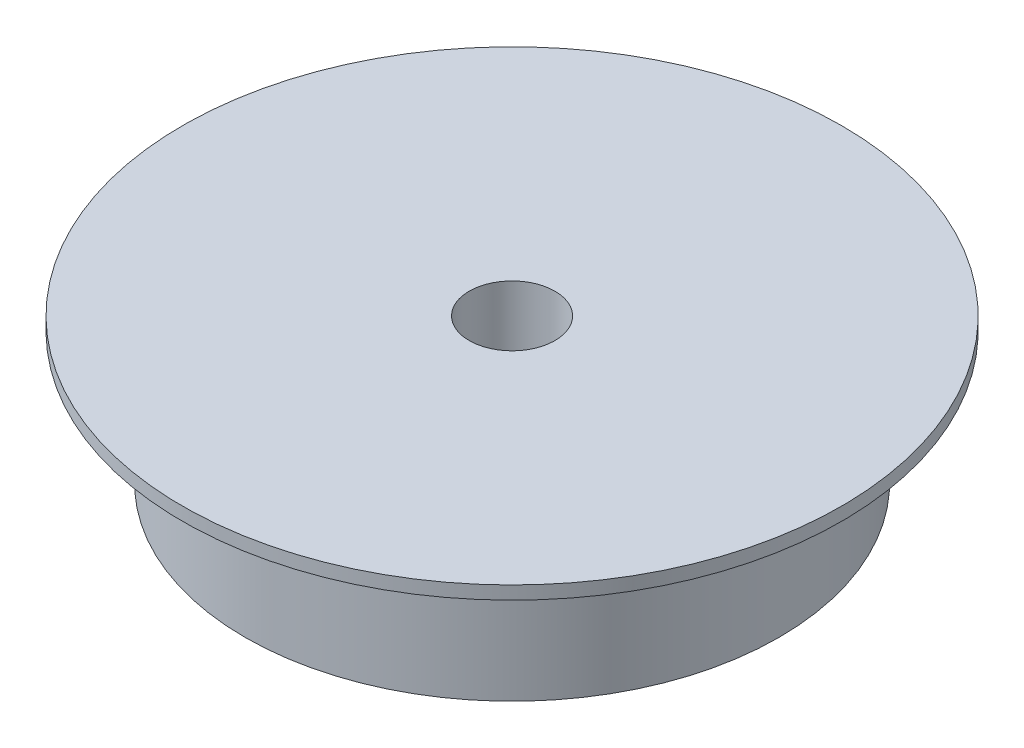
ISO-10303-21;
HEADER;
FILE_DESCRIPTION(('STEP AP214'),'2;1');
FILE_NAME('part.step','',(''),(''),'','','');
FILE_SCHEMA(('AUTOMOTIVE_DESIGN { 1 0 10303 214 1 1 1 1 }'));
ENDSEC;
DATA;
#1=APPLICATION_CONTEXT('core data for automotive mechanical design processes');
#2=APPLICATION_PROTOCOL_DEFINITION('international standard','automotive_design',2000,#1);
#3=PRODUCT_CONTEXT('',#1,'mechanical');
#4=PRODUCT('Part','Part','',(#3));
#5=PRODUCT_RELATED_PRODUCT_CATEGORY('part','',(#4));
#6=PRODUCT_DEFINITION_FORMATION('','',#4);
#7=PRODUCT_DEFINITION_CONTEXT('part definition',#1,'design');
#8=PRODUCT_DEFINITION('design','',#6,#7);
#9=PRODUCT_DEFINITION_SHAPE('','',#8);
#10=(LENGTH_UNIT() NAMED_UNIT(*) SI_UNIT(.MILLI.,.METRE.));
#11=(NAMED_UNIT(*) PLANE_ANGLE_UNIT() SI_UNIT($,.RADIAN.));
#12=(NAMED_UNIT(*) SI_UNIT($,.STERADIAN.) SOLID_ANGLE_UNIT());
#13=UNCERTAINTY_MEASURE_WITH_UNIT(LENGTH_MEASURE(1.E-05),#10,'distance_accuracy_value','');
#14=(GEOMETRIC_REPRESENTATION_CONTEXT(3) GLOBAL_UNCERTAINTY_ASSIGNED_CONTEXT((#13)) GLOBAL_UNIT_ASSIGNED_CONTEXT((#10,
#11,#12)) REPRESENTATION_CONTEXT('',''));
#15=CARTESIAN_POINT('',(0.,0.,0.));
#16=DIRECTION('',(0.,0.,1.));
#17=DIRECTION('',(1.,0.,0.));
#18=AXIS2_PLACEMENT_3D('',#15,#16,#17);
#19=CARTESIAN_POINT('',(101.25,0.,0.));
#20=DIRECTION('',(0.,-1.,0.));
#21=DIRECTION('',(0.,0.,-1.));
#22=AXIS2_PLACEMENT_3D('',#19,#20,#21);
#23=PLANE('',#22);
#24=CARTESIAN_POINT('',(0.,0.,0.));
#25=DIRECTION('',(0.,-1.,0.));
#26=DIRECTION('',(0.,0.,-1.));
#27=AXIS2_PLACEMENT_3D('',#24,#25,#26);
#28=CIRCLE('',#27,101.25);
#29=CARTESIAN_POINT('',(0.,0.,-101.25));
#30=VERTEX_POINT('',#29);
#31=EDGE_CURVE('E54',#30,#30,#28,.T.);
#32=ORIENTED_EDGE('',*,*,#31,.T.);
#33=EDGE_LOOP('',(#32));
#34=FACE_BOUND('',#33,.T.);
#35=CARTESIAN_POINT('',(0.,0.,0.));
#36=DIRECTION('',(0.,-1.,0.));
#37=DIRECTION('',(0.,0.,-1.));
#38=AXIS2_PLACEMENT_3D('',#35,#36,#37);
#39=CIRCLE('',#38,16.25);
#40=CARTESIAN_POINT('',(0.,0.,-16.25));
#41=VERTEX_POINT('',#40);
#42=EDGE_CURVE('E10',#41,#41,#39,.T.);
#43=ORIENTED_EDGE('',*,*,#42,.F.);
#44=EDGE_LOOP('',(#43));
#45=FACE_BOUND('',#44,.T.);
#46=ADVANCED_FACE('F32',(#34,#45),#23,.T.);
#47=CARTESIAN_POINT('',(0.,0.,0.));
#48=DIRECTION('',(0.,-1.,0.));
#49=DIRECTION('',(0.,0.,-1.));
#50=AXIS2_PLACEMENT_3D('',#47,#48,#49);
#51=CYLINDRICAL_SURFACE('',#50,16.25);
#52=ORIENTED_EDGE('',*,*,#42,.T.);
#53=EDGE_LOOP('',(#52));
#54=FACE_BOUND('',#53,.T.);
#55=CARTESIAN_POINT('',(0.,55.,0.));
#56=DIRECTION('',(0.,-1.,0.));
#57=DIRECTION('',(0.,0.,-1.));
#58=AXIS2_PLACEMENT_3D('',#55,#56,#57);
#59=CIRCLE('',#58,16.25);
#60=CARTESIAN_POINT('',(0.,55.,-16.25));
#61=VERTEX_POINT('',#60);
#62=EDGE_CURVE('E38',#61,#61,#59,.T.);
#63=ORIENTED_EDGE('',*,*,#62,.F.);
#64=EDGE_LOOP('',(#63));
#65=FACE_BOUND('',#64,.T.);
#66=ADVANCED_FACE('F72',(#54,#65),#51,.F.);
#67=CARTESIAN_POINT('',(16.25,55.,0.));
#68=DIRECTION('',(0.,1.,0.));
#69=DIRECTION('',(0.,0.,1.));
#70=AXIS2_PLACEMENT_3D('',#67,#68,#69);
#71=PLANE('',#70);
#72=ORIENTED_EDGE('',*,*,#62,.T.);
#73=EDGE_LOOP('',(#72));
#74=FACE_BOUND('',#73,.T.);
#75=CARTESIAN_POINT('',(0.,55.,0.));
#76=DIRECTION('',(0.,-1.,0.));
#77=DIRECTION('',(0.,0.,-1.));
#78=AXIS2_PLACEMENT_3D('',#75,#76,#77);
#79=CIRCLE('',#78,125.);
#80=CARTESIAN_POINT('',(0.,55.,-125.));
#81=VERTEX_POINT('',#80);
#82=EDGE_CURVE('E42',#81,#81,#79,.T.);
#83=ORIENTED_EDGE('',*,*,#82,.F.);
#84=EDGE_LOOP('',(#83));
#85=FACE_BOUND('',#84,.T.);
#86=ADVANCED_FACE('F76',(#74,#85),#71,.T.);
#87=CARTESIAN_POINT('',(0.,0.,0.));
#88=DIRECTION('',(0.,-1.,0.));
#89=DIRECTION('',(0.,0.,-1.));
#90=AXIS2_PLACEMENT_3D('',#87,#88,#89);
#91=CYLINDRICAL_SURFACE('',#90,125.);
#92=ORIENTED_EDGE('',*,*,#82,.T.);
#93=EDGE_LOOP('',(#92));
#94=FACE_BOUND('',#93,.T.);
#95=CARTESIAN_POINT('',(0.,50.,0.));
#96=DIRECTION('',(0.,-1.,0.));
#97=DIRECTION('',(0.,0.,-1.));
#98=AXIS2_PLACEMENT_3D('',#95,#96,#97);
#99=CIRCLE('',#98,125.);
#100=CARTESIAN_POINT('',(0.,50.,-125.));
#101=VERTEX_POINT('',#100);
#102=EDGE_CURVE('E46',#101,#101,#99,.T.);
#103=ORIENTED_EDGE('',*,*,#102,.F.);
#104=EDGE_LOOP('',(#103));
#105=FACE_BOUND('',#104,.T.);
#106=ADVANCED_FACE('F68',(#94,#105),#91,.T.);
#107=CARTESIAN_POINT('',(125.,50.,0.));
#108=DIRECTION('',(0.,-1.,0.));
#109=DIRECTION('',(0.,0.,-1.));
#110=AXIS2_PLACEMENT_3D('',#107,#108,#109);
#111=PLANE('',#110);
#112=ORIENTED_EDGE('',*,*,#102,.T.);
#113=EDGE_LOOP('',(#112));
#114=FACE_BOUND('',#113,.T.);
#115=CARTESIAN_POINT('',(0.,50.,0.));
#116=DIRECTION('',(0.,-1.,0.));
#117=DIRECTION('',(0.,0.,-1.));
#118=AXIS2_PLACEMENT_3D('',#115,#116,#117);
#119=CIRCLE('',#118,101.25);
#120=CARTESIAN_POINT('',(0.,50.,-101.25));
#121=VERTEX_POINT('',#120);
#122=EDGE_CURVE('E51',#121,#121,#119,.T.);
#123=ORIENTED_EDGE('',*,*,#122,.F.);
#124=EDGE_LOOP('',(#123));
#125=FACE_BOUND('',#124,.T.);
#126=ADVANCED_FACE('F62',(#114,#125),#111,.T.);
#127=CARTESIAN_POINT('',(0.,0.,0.));
#128=DIRECTION('',(0.,-1.,0.));
#129=DIRECTION('',(0.,0.,-1.));
#130=AXIS2_PLACEMENT_3D('',#127,#128,#129);
#131=CYLINDRICAL_SURFACE('',#130,101.25);
#132=ORIENTED_EDGE('',*,*,#122,.T.);
#133=EDGE_LOOP('',(#132));
#134=FACE_BOUND('',#133,.T.);
#135=ORIENTED_EDGE('',*,*,#31,.F.);
#136=EDGE_LOOP('',(#135));
#137=FACE_BOUND('',#136,.T.);
#138=ADVANCED_FACE('F60',(#134,#137),#131,.T.);
#139=CLOSED_SHELL('',(#46,#66,#86,#106,#126,#138));
#140=MANIFOLD_SOLID_BREP('B2',#139);
#141=ADVANCED_BREP_SHAPE_REPRESENTATION('',(#18,#140),#14);
#142=SHAPE_DEFINITION_REPRESENTATION(#9,#141);
ENDSEC;
END-ISO-10303-21;
